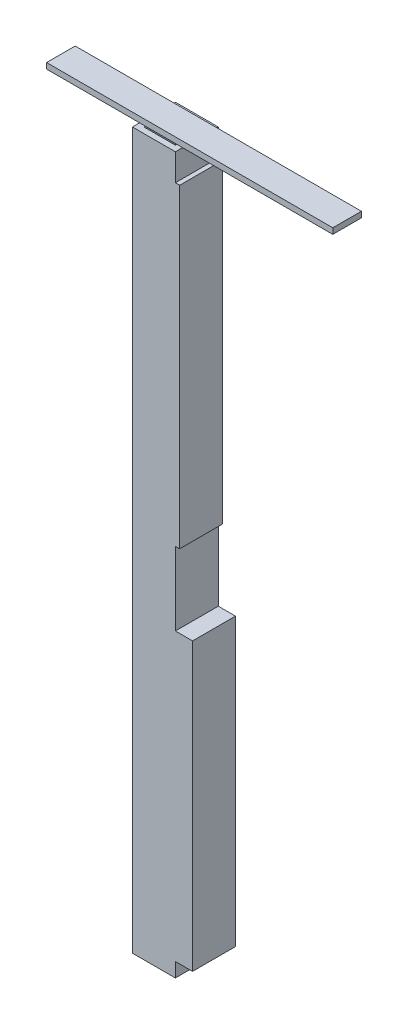
ISO-10303-21;
HEADER;
FILE_DESCRIPTION(('STEP AP214'),'2;1');
FILE_NAME('part.step','',(''),(''),'','','');
FILE_SCHEMA(('AUTOMOTIVE_DESIGN { 1 0 10303 214 1 1 1 1 }'));
ENDSEC;
DATA;
#1=APPLICATION_CONTEXT('core data for automotive mechanical design processes');
#2=APPLICATION_PROTOCOL_DEFINITION('international standard','automotive_design',2000,#1);
#3=PRODUCT_CONTEXT('',#1,'mechanical');
#4=PRODUCT('Part','Part','',(#3));
#5=PRODUCT_RELATED_PRODUCT_CATEGORY('part','',(#4));
#6=PRODUCT_DEFINITION_FORMATION('','',#4);
#7=PRODUCT_DEFINITION_CONTEXT('part definition',#1,'design');
#8=PRODUCT_DEFINITION('design','',#6,#7);
#9=PRODUCT_DEFINITION_SHAPE('','',#8);
#10=(LENGTH_UNIT() NAMED_UNIT(*) SI_UNIT(.MILLI.,.METRE.));
#11=(NAMED_UNIT(*) PLANE_ANGLE_UNIT() SI_UNIT($,.RADIAN.));
#12=(NAMED_UNIT(*) SI_UNIT($,.STERADIAN.) SOLID_ANGLE_UNIT());
#13=UNCERTAINTY_MEASURE_WITH_UNIT(LENGTH_MEASURE(1.E-05),#10,'distance_accuracy_value','');
#14=(GEOMETRIC_REPRESENTATION_CONTEXT(3) GLOBAL_UNCERTAINTY_ASSIGNED_CONTEXT((#13)) GLOBAL_UNIT_ASSIGNED_CONTEXT((#10,
#11,#12)) REPRESENTATION_CONTEXT('',''));
#15=CARTESIAN_POINT('',(0.,0.,0.));
#16=DIRECTION('',(0.,0.,1.));
#17=DIRECTION('',(1.,0.,0.));
#18=AXIS2_PLACEMENT_3D('',#15,#16,#17);
#19=CARTESIAN_POINT('',(15.,500.,-15.));
#20=DIRECTION('',(-1.,0.,0.));
#21=DIRECTION('',(0.,0.,1.));
#22=AXIS2_PLACEMENT_3D('',#19,#20,#21);
#23=PLANE('',#22);
#24=DIRECTION('',(0.,0.,-1.));
#25=VECTOR('',#24,1.);
#26=CARTESIAN_POINT('',(15.,261.238460256624,15.));
#27=LINE('',#26,#25);
#28=CARTESIAN_POINT('',(15.,261.238460256624,15.));
#29=VERTEX_POINT('',#28);
#30=CARTESIAN_POINT('',(15.,261.238460256624,-15.));
#31=VERTEX_POINT('',#30);
#32=EDGE_CURVE('E483',#29,#31,#27,.T.);
#33=ORIENTED_EDGE('',*,*,#32,.F.);
#34=DIRECTION('',(0.,-1.,0.));
#35=VECTOR('',#34,1.);
#36=CARTESIAN_POINT('',(15.,500.,15.));
#37=LINE('',#36,#35);
#38=CARTESIAN_POINT('',(15.,210.,15.));
#39=VERTEX_POINT('',#38);
#40=EDGE_CURVE('E219',#29,#39,#37,.T.);
#41=ORIENTED_EDGE('',*,*,#40,.T.);
#42=DIRECTION('',(0.,0.,1.));
#43=VECTOR('',#42,1.);
#44=CARTESIAN_POINT('',(15.,210.,15.));
#45=LINE('',#44,#43);
#46=CARTESIAN_POINT('',(15.,210.,-15.));
#47=VERTEX_POINT('',#46);
#48=EDGE_CURVE('E222',#47,#39,#45,.T.);
#49=ORIENTED_EDGE('',*,*,#48,.F.);
#50=DIRECTION('',(0.,-1.,0.));
#51=VECTOR('',#50,1.);
#52=CARTESIAN_POINT('',(15.,500.,-15.));
#53=LINE('',#52,#51);
#54=EDGE_CURVE('E350',#31,#47,#53,.T.);
#55=ORIENTED_EDGE('',*,*,#54,.F.);
#56=EDGE_LOOP('',(#33,#41,#49,#55));
#57=FACE_BOUND('',#56,.T.);
#58=ADVANCED_FACE('F33',(#57),#23,.F.);
#59=DIRECTION('',(0.,0.,1.));
#60=VECTOR('',#59,1.);
#61=CARTESIAN_POINT('',(15.,481.238460256624,15.));
#62=LINE('',#61,#60);
#63=CARTESIAN_POINT('',(15.,481.238460256624,-15.));
#64=VERTEX_POINT('',#63);
#65=CARTESIAN_POINT('',(15.,481.238460256624,15.));
#66=VERTEX_POINT('',#65);
#67=EDGE_CURVE('E213',#64,#66,#62,.T.);
#68=ORIENTED_EDGE('',*,*,#67,.F.);
#69=CARTESIAN_POINT('',(15.,500.,-15.));
#70=VERTEX_POINT('',#69);
#71=EDGE_CURVE('E347',#70,#64,#53,.T.);
#72=ORIENTED_EDGE('',*,*,#71,.F.);
#73=DIRECTION('',(0.,0.,-1.));
#74=VECTOR('',#73,1.);
#75=CARTESIAN_POINT('',(15.,500.,-15.));
#76=LINE('',#75,#74);
#77=CARTESIAN_POINT('',(15.,500.,-10.));
#78=VERTEX_POINT('',#77);
#79=EDGE_CURVE('E328',#78,#70,#76,.T.);
#80=ORIENTED_EDGE('',*,*,#79,.F.);
#81=CARTESIAN_POINT('',(15.,500.,10.));
#82=VERTEX_POINT('',#81);
#83=EDGE_CURVE('E332',#82,#78,#76,.T.);
#84=ORIENTED_EDGE('',*,*,#83,.F.);
#85=CARTESIAN_POINT('',(15.,500.,15.));
#86=VERTEX_POINT('',#85);
#87=EDGE_CURVE('E329',#86,#82,#76,.T.);
#88=ORIENTED_EDGE('',*,*,#87,.F.);
#89=EDGE_CURVE('E351',#86,#66,#37,.T.);
#90=ORIENTED_EDGE('',*,*,#89,.T.);
#91=EDGE_LOOP('',(#68,#72,#80,#84,#88,#90));
#92=FACE_BOUND('',#91,.T.);
#93=ADVANCED_FACE('F428',(#92),#23,.F.);
#94=DIRECTION('',(0.,0.,-1.));
#95=VECTOR('',#94,1.);
#96=CARTESIAN_POINT('',(15.,10.,15.));
#97=LINE('',#96,#95);
#98=CARTESIAN_POINT('',(15.,10.,15.));
#99=VERTEX_POINT('',#98);
#100=CARTESIAN_POINT('',(15.,9.99999999999995,-15.));
#101=VERTEX_POINT('',#100);
#102=EDGE_CURVE('E220',#99,#101,#97,.T.);
#103=ORIENTED_EDGE('',*,*,#102,.F.);
#104=CARTESIAN_POINT('',(15.,0.,15.));
#105=VERTEX_POINT('',#104);
#106=EDGE_CURVE('E349',#99,#105,#37,.T.);
#107=ORIENTED_EDGE('',*,*,#106,.T.);
#108=DIRECTION('',(0.,0.,-1.));
#109=VECTOR('',#108,1.);
#110=CARTESIAN_POINT('',(15.,0.,-15.));
#111=LINE('',#110,#109);
#112=CARTESIAN_POINT('',(15.,0.,-15.));
#113=VERTEX_POINT('',#112);
#114=EDGE_CURVE('E339',#105,#113,#111,.T.);
#115=ORIENTED_EDGE('',*,*,#114,.T.);
#116=EDGE_CURVE('E346',#101,#113,#53,.T.);
#117=ORIENTED_EDGE('',*,*,#116,.F.);
#118=EDGE_LOOP('',(#103,#107,#115,#117));
#119=FACE_BOUND('',#118,.T.);
#120=ADVANCED_FACE('F361',(#119),#23,.F.);
#121=CARTESIAN_POINT('',(-15.,500.,15.));
#122=DIRECTION('',(0.,1.,0.));
#123=DIRECTION('',(0.,0.,1.));
#124=AXIS2_PLACEMENT_3D('',#121,#122,#123);
#125=PLANE('',#124);
#126=DIRECTION('',(-1.,0.,0.));
#127=VECTOR('',#126,1.);
#128=CARTESIAN_POINT('',(-80.,500.,-10.));
#129=LINE('',#128,#127);
#130=CARTESIAN_POINT('',(11.,500.,-10.));
#131=VERTEX_POINT('',#130);
#132=EDGE_CURVE('E11',#78,#131,#129,.T.);
#133=ORIENTED_EDGE('',*,*,#132,.F.);
#134=ORIENTED_EDGE('',*,*,#79,.T.);
#135=DIRECTION('',(-1.,0.,0.));
#136=VECTOR('',#135,1.);
#137=CARTESIAN_POINT('',(-15.,500.,-15.));
#138=LINE('',#137,#136);
#139=CARTESIAN_POINT('',(-15.,500.,-15.));
#140=VERTEX_POINT('',#139);
#141=EDGE_CURVE('E331',#70,#140,#138,.T.);
#142=ORIENTED_EDGE('',*,*,#141,.T.);
#143=DIRECTION('',(0.,0.,1.));
#144=VECTOR('',#143,1.);
#145=CARTESIAN_POINT('',(-15.,500.,-15.));
#146=LINE('',#145,#144);
#147=CARTESIAN_POINT('',(-15.,500.,-10.));
#148=VERTEX_POINT('',#147);
#149=EDGE_CURVE('E321',#140,#148,#146,.T.);
#150=ORIENTED_EDGE('',*,*,#149,.T.);
#151=CARTESIAN_POINT('',(-11.,500.,-10.));
#152=VERTEX_POINT('',#151);
#153=EDGE_CURVE('E42',#152,#148,#129,.T.);
#154=ORIENTED_EDGE('',*,*,#153,.F.);
#155=DIRECTION('',(0.,0.,1.));
#156=VECTOR('',#155,1.);
#157=CARTESIAN_POINT('',(-11.,500.,-11.));
#158=LINE('',#157,#156);
#159=CARTESIAN_POINT('',(-11.,500.,-11.));
#160=VERTEX_POINT('',#159);
#161=EDGE_CURVE('E297',#160,#152,#158,.T.);
#162=ORIENTED_EDGE('',*,*,#161,.F.);
#163=DIRECTION('',(-1.,0.,0.));
#164=VECTOR('',#163,1.);
#165=CARTESIAN_POINT('',(-11.,500.,-11.));
#166=LINE('',#165,#164);
#167=CARTESIAN_POINT('',(11.,500.,-11.));
#168=VERTEX_POINT('',#167);
#169=EDGE_CURVE('E287',#168,#160,#166,.T.);
#170=ORIENTED_EDGE('',*,*,#169,.F.);
#171=DIRECTION('',(0.,0.,-1.));
#172=VECTOR('',#171,1.);
#173=CARTESIAN_POINT('',(11.,500.,-11.));
#174=LINE('',#173,#172);
#175=EDGE_CURVE('E304',#131,#168,#174,.T.);
#176=ORIENTED_EDGE('',*,*,#175,.F.);
#177=EDGE_LOOP('',(#133,#134,#142,#150,#154,#162,#170,#176));
#178=FACE_BOUND('',#177,.T.);
#179=ADVANCED_FACE('F380',(#178),#125,.T.);
#180=CARTESIAN_POINT('',(-15.,500.,-15.));
#181=DIRECTION('',(1.,0.,0.));
#182=DIRECTION('',(0.,0.,-1.));
#183=AXIS2_PLACEMENT_3D('',#180,#181,#182);
#184=PLANE('',#183);
#185=DIRECTION('',(0.,0.,1.));
#186=VECTOR('',#185,1.);
#187=CARTESIAN_POINT('',(-15.,0.,-15.));
#188=LINE('',#187,#186);
#189=CARTESIAN_POINT('',(-15.,0.,-15.));
#190=VERTEX_POINT('',#189);
#191=CARTESIAN_POINT('',(-15.,0.,15.));
#192=VERTEX_POINT('',#191);
#193=EDGE_CURVE('E313',#190,#192,#188,.T.);
#194=ORIENTED_EDGE('',*,*,#193,.T.);
#195=DIRECTION('',(0.,-1.,0.));
#196=VECTOR('',#195,1.);
#197=CARTESIAN_POINT('',(-15.,500.,15.));
#198=LINE('',#197,#196);
#199=CARTESIAN_POINT('',(-15.,500.,15.));
#200=VERTEX_POINT('',#199);
#201=EDGE_CURVE('E37',#200,#192,#198,.T.);
#202=ORIENTED_EDGE('',*,*,#201,.F.);
#203=CARTESIAN_POINT('',(-15.,500.,10.));
#204=VERTEX_POINT('',#203);
#205=EDGE_CURVE('E326',#204,#200,#146,.T.);
#206=ORIENTED_EDGE('',*,*,#205,.F.);
#207=EDGE_CURVE('E325',#148,#204,#146,.T.);
#208=ORIENTED_EDGE('',*,*,#207,.F.);
#209=ORIENTED_EDGE('',*,*,#149,.F.);
#210=DIRECTION('',(0.,-1.,0.));
#211=VECTOR('',#210,1.);
#212=CARTESIAN_POINT('',(-15.,500.,-15.));
#213=LINE('',#212,#211);
#214=EDGE_CURVE('E334',#140,#190,#213,.T.);
#215=ORIENTED_EDGE('',*,*,#214,.T.);
#216=EDGE_LOOP('',(#194,#202,#206,#208,#209,#215));
#217=FACE_BOUND('',#216,.T.);
#218=ADVANCED_FACE('F35',(#217),#184,.F.);
#219=CARTESIAN_POINT('',(-15.,500.,15.));
#220=DIRECTION('',(0.,0.,-1.));
#221=DIRECTION('',(-1.,0.,0.));
#222=AXIS2_PLACEMENT_3D('',#219,#220,#221);
#223=PLANE('',#222);
#224=DIRECTION('',(1.,0.,0.));
#225=VECTOR('',#224,1.);
#226=CARTESIAN_POINT('',(-15.,0.,15.));
#227=LINE('',#226,#225);
#228=EDGE_CURVE('E337',#192,#105,#227,.T.);
#229=ORIENTED_EDGE('',*,*,#228,.T.);
#230=ORIENTED_EDGE('',*,*,#106,.F.);
#231=DIRECTION('',(-1.,0.,0.));
#232=VECTOR('',#231,1.);
#233=CARTESIAN_POINT('',(27.,10.,15.));
#234=LINE('',#233,#232);
#235=CARTESIAN_POINT('',(27.,10.,15.));
#236=VERTEX_POINT('',#235);
#237=EDGE_CURVE('E245',#236,#99,#234,.T.);
#238=ORIENTED_EDGE('',*,*,#237,.F.);
#239=DIRECTION('',(0.,-1.,0.));
#240=VECTOR('',#239,1.);
#241=CARTESIAN_POINT('',(27.,210.,15.));
#242=LINE('',#241,#240);
#243=CARTESIAN_POINT('',(27.,210.,15.));
#244=VERTEX_POINT('',#243);
#245=EDGE_CURVE('E228',#244,#236,#242,.T.);
#246=ORIENTED_EDGE('',*,*,#245,.F.);
#247=DIRECTION('',(-1.,0.,0.));
#248=VECTOR('',#247,1.);
#249=CARTESIAN_POINT('',(27.,210.,15.));
#250=LINE('',#249,#248);
#251=EDGE_CURVE('E236',#244,#39,#250,.T.);
#252=ORIENTED_EDGE('',*,*,#251,.T.);
#253=ORIENTED_EDGE('',*,*,#40,.F.);
#254=DIRECTION('',(-1.,0.,0.));
#255=VECTOR('',#254,1.);
#256=CARTESIAN_POINT('',(18.,261.238460256624,15.));
#257=LINE('',#256,#255);
#258=CARTESIAN_POINT('',(18.,261.238460256624,15.));
#259=VERTEX_POINT('',#258);
#260=EDGE_CURVE('E200',#259,#29,#257,.T.);
#261=ORIENTED_EDGE('',*,*,#260,.F.);
#262=DIRECTION('',(0.,-1.,0.));
#263=VECTOR('',#262,1.);
#264=CARTESIAN_POINT('',(18.,481.238460256624,15.));
#265=LINE('',#264,#263);
#266=CARTESIAN_POINT('',(18.,481.238460256624,15.));
#267=VERTEX_POINT('',#266);
#268=EDGE_CURVE('E204',#267,#259,#265,.T.);
#269=ORIENTED_EDGE('',*,*,#268,.F.);
#270=DIRECTION('',(-1.,0.,0.));
#271=VECTOR('',#270,1.);
#272=CARTESIAN_POINT('',(18.,481.238460256624,15.));
#273=LINE('',#272,#271);
#274=EDGE_CURVE('E477',#267,#66,#273,.T.);
#275=ORIENTED_EDGE('',*,*,#274,.T.);
#276=ORIENTED_EDGE('',*,*,#89,.F.);
#277=DIRECTION('',(1.,0.,0.));
#278=VECTOR('',#277,1.);
#279=CARTESIAN_POINT('',(-15.,500.,15.));
#280=LINE('',#279,#278);
#281=EDGE_CURVE('E324',#200,#86,#280,.T.);
#282=ORIENTED_EDGE('',*,*,#281,.F.);
#283=ORIENTED_EDGE('',*,*,#201,.T.);
#284=EDGE_LOOP('',(#229,#230,#238,#246,#252,#253,#261,#269,#275,#276,#282,#283));
#285=FACE_BOUND('',#284,.T.);
#286=ADVANCED_FACE('F217',(#285),#223,.F.);
#287=CARTESIAN_POINT('',(-15.,500.,-15.));
#288=DIRECTION('',(0.,0.,1.));
#289=DIRECTION('',(1.,0.,0.));
#290=AXIS2_PLACEMENT_3D('',#287,#288,#289);
#291=PLANE('',#290);
#292=DIRECTION('',(-1.,0.,0.));
#293=VECTOR('',#292,1.);
#294=CARTESIAN_POINT('',(-15.,0.,-15.));
#295=LINE('',#294,#293);
#296=EDGE_CURVE('E342',#113,#190,#295,.T.);
#297=ORIENTED_EDGE('',*,*,#296,.T.);
#298=ORIENTED_EDGE('',*,*,#214,.F.);
#299=ORIENTED_EDGE('',*,*,#141,.F.);
#300=ORIENTED_EDGE('',*,*,#71,.T.);
#301=DIRECTION('',(-1.,0.,0.));
#302=VECTOR('',#301,1.);
#303=CARTESIAN_POINT('',(18.,481.238460256624,-15.));
#304=LINE('',#303,#302);
#305=CARTESIAN_POINT('',(18.,481.238460256624,-15.));
#306=VERTEX_POINT('',#305);
#307=EDGE_CURVE('E224',#306,#64,#304,.T.);
#308=ORIENTED_EDGE('',*,*,#307,.F.);
#309=DIRECTION('',(0.,1.,0.));
#310=VECTOR('',#309,1.);
#311=CARTESIAN_POINT('',(18.,481.238460256624,-15.));
#312=LINE('',#311,#310);
#313=CARTESIAN_POINT('',(18.,261.238460256624,-15.));
#314=VERTEX_POINT('',#313);
#315=EDGE_CURVE('E203',#314,#306,#312,.T.);
#316=ORIENTED_EDGE('',*,*,#315,.F.);
#317=DIRECTION('',(-1.,0.,0.));
#318=VECTOR('',#317,1.);
#319=CARTESIAN_POINT('',(18.,261.238460256624,-15.));
#320=LINE('',#319,#318);
#321=EDGE_CURVE('E51',#314,#31,#320,.T.);
#322=ORIENTED_EDGE('',*,*,#321,.T.);
#323=ORIENTED_EDGE('',*,*,#54,.T.);
#324=DIRECTION('',(-1.,0.,0.));
#325=VECTOR('',#324,1.);
#326=CARTESIAN_POINT('',(27.,210.,-15.));
#327=LINE('',#326,#325);
#328=CARTESIAN_POINT('',(27.,210.,-15.));
#329=VERTEX_POINT('',#328);
#330=EDGE_CURVE('E241',#329,#47,#327,.T.);
#331=ORIENTED_EDGE('',*,*,#330,.F.);
#332=DIRECTION('',(0.,1.,0.));
#333=VECTOR('',#332,1.);
#334=CARTESIAN_POINT('',(27.,210.,-15.));
#335=LINE('',#334,#333);
#336=CARTESIAN_POINT('',(27.,10.,-15.));
#337=VERTEX_POINT('',#336);
#338=EDGE_CURVE('E233',#337,#329,#335,.T.);
#339=ORIENTED_EDGE('',*,*,#338,.F.);
#340=DIRECTION('',(-1.,0.,0.));
#341=VECTOR('',#340,1.);
#342=CARTESIAN_POINT('',(27.,10.,-15.));
#343=LINE('',#342,#341);
#344=EDGE_CURVE('E58',#337,#101,#343,.T.);
#345=ORIENTED_EDGE('',*,*,#344,.T.);
#346=ORIENTED_EDGE('',*,*,#116,.T.);
#347=EDGE_LOOP('',(#297,#298,#299,#300,#308,#316,#322,#323,#331,#339,#345,#346));
#348=FACE_BOUND('',#347,.T.);
#349=ADVANCED_FACE('F372',(#348),#291,.F.);
#350=DIRECTION('',(1.,0.,0.));
#351=VECTOR('',#350,1.);
#352=CARTESIAN_POINT('',(-80.,500.,10.));
#353=LINE('',#352,#351);
#354=CARTESIAN_POINT('',(-11.,500.,10.));
#355=VERTEX_POINT('',#354);
#356=EDGE_CURVE('E391',#204,#355,#353,.T.);
#357=ORIENTED_EDGE('',*,*,#356,.F.);
#358=ORIENTED_EDGE('',*,*,#205,.T.);
#359=ORIENTED_EDGE('',*,*,#281,.T.);
#360=ORIENTED_EDGE('',*,*,#87,.T.);
#361=CARTESIAN_POINT('',(11.,500.,10.));
#362=VERTEX_POINT('',#361);
#363=EDGE_CURVE('E267',#362,#82,#353,.T.);
#364=ORIENTED_EDGE('',*,*,#363,.F.);
#365=CARTESIAN_POINT('',(11.,500.,11.));
#366=VERTEX_POINT('',#365);
#367=EDGE_CURVE('E305',#366,#362,#174,.T.);
#368=ORIENTED_EDGE('',*,*,#367,.F.);
#369=DIRECTION('',(1.,0.,0.));
#370=VECTOR('',#369,1.);
#371=CARTESIAN_POINT('',(-11.,500.,11.));
#372=LINE('',#371,#370);
#373=CARTESIAN_POINT('',(-11.,500.,11.));
#374=VERTEX_POINT('',#373);
#375=EDGE_CURVE('E300',#374,#366,#372,.T.);
#376=ORIENTED_EDGE('',*,*,#375,.F.);
#377=EDGE_CURVE('E282',#355,#374,#158,.T.);
#378=ORIENTED_EDGE('',*,*,#377,.F.);
#379=EDGE_LOOP('',(#357,#358,#359,#360,#364,#368,#376,#378));
#380=FACE_BOUND('',#379,.T.);
#381=ADVANCED_FACE('F440',(#380),#125,.T.);
#382=CARTESIAN_POINT('',(-15.,0.,15.));
#383=DIRECTION('',(0.,1.,0.));
#384=DIRECTION('',(0.,0.,1.));
#385=AXIS2_PLACEMENT_3D('',#382,#383,#384);
#386=PLANE('',#385);
#387=DIRECTION('',(-1.,0.,0.));
#388=VECTOR('',#387,1.);
#389=CARTESIAN_POINT('',(-11.,0.,-11.));
#390=LINE('',#389,#388);
#391=CARTESIAN_POINT('',(11.,0.,-11.));
#392=VERTEX_POINT('',#391);
#393=CARTESIAN_POINT('',(-11.,0.,-11.));
#394=VERTEX_POINT('',#393);
#395=EDGE_CURVE('E293',#392,#394,#390,.T.);
#396=ORIENTED_EDGE('',*,*,#395,.T.);
#397=DIRECTION('',(0.,0.,1.));
#398=VECTOR('',#397,1.);
#399=CARTESIAN_POINT('',(-11.,0.,-11.));
#400=LINE('',#399,#398);
#401=CARTESIAN_POINT('',(-11.,0.,11.));
#402=VERTEX_POINT('',#401);
#403=EDGE_CURVE('E283',#394,#402,#400,.T.);
#404=ORIENTED_EDGE('',*,*,#403,.T.);
#405=DIRECTION('',(1.,0.,0.));
#406=VECTOR('',#405,1.);
#407=CARTESIAN_POINT('',(-11.,0.,11.));
#408=LINE('',#407,#406);
#409=CARTESIAN_POINT('',(11.,0.,11.));
#410=VERTEX_POINT('',#409);
#411=EDGE_CURVE('E286',#402,#410,#408,.T.);
#412=ORIENTED_EDGE('',*,*,#411,.T.);
#413=DIRECTION('',(0.,0.,-1.));
#414=VECTOR('',#413,1.);
#415=CARTESIAN_POINT('',(11.,0.,-11.));
#416=LINE('',#415,#414);
#417=EDGE_CURVE('E290',#410,#392,#416,.T.);
#418=ORIENTED_EDGE('',*,*,#417,.T.);
#419=EDGE_LOOP('',(#396,#404,#412,#418));
#420=FACE_BOUND('',#419,.T.);
#421=ORIENTED_EDGE('',*,*,#193,.F.);
#422=ORIENTED_EDGE('',*,*,#296,.F.);
#423=ORIENTED_EDGE('',*,*,#114,.F.);
#424=ORIENTED_EDGE('',*,*,#228,.F.);
#425=EDGE_LOOP('',(#421,#422,#423,#424));
#426=FACE_BOUND('',#425,.T.);
#427=ADVANCED_FACE('F370',(#420,#426),#386,.F.);
#428=CARTESIAN_POINT('',(-11.,0.,-11.));
#429=DIRECTION('',(-1.,0.,0.));
#430=DIRECTION('',(0.,0.,1.));
#431=AXIS2_PLACEMENT_3D('',#428,#429,#430);
#432=PLANE('',#431);
#433=ORIENTED_EDGE('',*,*,#161,.T.);
#434=EDGE_CURVE('E301',#152,#355,#158,.T.);
#435=ORIENTED_EDGE('',*,*,#434,.T.);
#436=ORIENTED_EDGE('',*,*,#377,.T.);
#437=DIRECTION('',(0.,1.,0.));
#438=VECTOR('',#437,1.);
#439=CARTESIAN_POINT('',(-11.,0.,11.));
#440=LINE('',#439,#438);
#441=EDGE_CURVE('E296',#402,#374,#440,.T.);
#442=ORIENTED_EDGE('',*,*,#441,.F.);
#443=ORIENTED_EDGE('',*,*,#403,.F.);
#444=DIRECTION('',(0.,1.,0.));
#445=VECTOR('',#444,1.);
#446=CARTESIAN_POINT('',(-11.,0.,-11.));
#447=LINE('',#446,#445);
#448=EDGE_CURVE('E311',#394,#160,#447,.T.);
#449=ORIENTED_EDGE('',*,*,#448,.T.);
#450=EDGE_LOOP('',(#433,#435,#436,#442,#443,#449));
#451=FACE_BOUND('',#450,.T.);
#452=ADVANCED_FACE('F452',(#451),#432,.F.);
#453=CARTESIAN_POINT('',(-11.,0.,-11.));
#454=DIRECTION('',(0.,0.,-1.));
#455=DIRECTION('',(-1.,0.,0.));
#456=AXIS2_PLACEMENT_3D('',#453,#454,#455);
#457=PLANE('',#456);
#458=ORIENTED_EDGE('',*,*,#169,.T.);
#459=ORIENTED_EDGE('',*,*,#448,.F.);
#460=ORIENTED_EDGE('',*,*,#395,.F.);
#461=DIRECTION('',(0.,1.,0.));
#462=VECTOR('',#461,1.);
#463=CARTESIAN_POINT('',(11.,0.,-11.));
#464=LINE('',#463,#462);
#465=EDGE_CURVE('E314',#392,#168,#464,.T.);
#466=ORIENTED_EDGE('',*,*,#465,.T.);
#467=EDGE_LOOP('',(#458,#459,#460,#466));
#468=FACE_BOUND('',#467,.T.);
#469=ADVANCED_FACE('F467',(#468),#457,.F.);
#470=CARTESIAN_POINT('',(11.,0.,-11.));
#471=DIRECTION('',(1.,0.,0.));
#472=DIRECTION('',(0.,0.,-1.));
#473=AXIS2_PLACEMENT_3D('',#470,#471,#472);
#474=PLANE('',#473);
#475=ORIENTED_EDGE('',*,*,#367,.T.);
#476=EDGE_CURVE('E308',#362,#131,#174,.T.);
#477=ORIENTED_EDGE('',*,*,#476,.T.);
#478=ORIENTED_EDGE('',*,*,#175,.T.);
#479=ORIENTED_EDGE('',*,*,#465,.F.);
#480=ORIENTED_EDGE('',*,*,#417,.F.);
#481=DIRECTION('',(0.,1.,0.));
#482=VECTOR('',#481,1.);
#483=CARTESIAN_POINT('',(11.,0.,11.));
#484=LINE('',#483,#482);
#485=EDGE_CURVE('E317',#410,#366,#484,.T.);
#486=ORIENTED_EDGE('',*,*,#485,.T.);
#487=EDGE_LOOP('',(#475,#477,#478,#479,#480,#486));
#488=FACE_BOUND('',#487,.T.);
#489=ADVANCED_FACE('F463',(#488),#474,.F.);
#490=CARTESIAN_POINT('',(-11.,0.,11.));
#491=DIRECTION('',(0.,0.,1.));
#492=DIRECTION('',(1.,0.,0.));
#493=AXIS2_PLACEMENT_3D('',#490,#491,#492);
#494=PLANE('',#493);
#495=ORIENTED_EDGE('',*,*,#375,.T.);
#496=ORIENTED_EDGE('',*,*,#485,.F.);
#497=ORIENTED_EDGE('',*,*,#411,.F.);
#498=ORIENTED_EDGE('',*,*,#441,.T.);
#499=EDGE_LOOP('',(#495,#496,#497,#498));
#500=FACE_BOUND('',#499,.T.);
#501=ADVANCED_FACE('F472',(#500),#494,.F.);
#502=CARTESIAN_POINT('',(-80.,500.,10.));
#503=DIRECTION('',(0.,1.,0.));
#504=DIRECTION('',(0.,0.,1.));
#505=AXIS2_PLACEMENT_3D('',#502,#503,#504);
#506=PLANE('',#505);
#507=CARTESIAN_POINT('',(-80.,500.,-10.));
#508=VERTEX_POINT('',#507);
#509=EDGE_CURVE('E268',#148,#508,#129,.T.);
#510=ORIENTED_EDGE('',*,*,#509,.F.);
#511=ORIENTED_EDGE('',*,*,#207,.T.);
#512=CARTESIAN_POINT('',(-80.,500.,10.));
#513=VERTEX_POINT('',#512);
#514=EDGE_CURVE('E262',#513,#204,#353,.T.);
#515=ORIENTED_EDGE('',*,*,#514,.F.);
#516=DIRECTION('',(0.,0.,1.));
#517=VECTOR('',#516,1.);
#518=CARTESIAN_POINT('',(-80.,500.,-10.));
#519=LINE('',#518,#517);
#520=EDGE_CURVE('E247',#508,#513,#519,.T.);
#521=ORIENTED_EDGE('',*,*,#520,.F.);
#522=EDGE_LOOP('',(#510,#511,#515,#521));
#523=FACE_BOUND('',#522,.T.);
#524=ADVANCED_FACE('F385',(#523),#506,.F.);
#525=CARTESIAN_POINT('',(120.,500.,10.));
#526=VERTEX_POINT('',#525);
#527=EDGE_CURVE('E261',#82,#526,#353,.T.);
#528=ORIENTED_EDGE('',*,*,#527,.F.);
#529=ORIENTED_EDGE('',*,*,#83,.T.);
#530=CARTESIAN_POINT('',(120.,500.,-10.));
#531=VERTEX_POINT('',#530);
#532=EDGE_CURVE('E252',#531,#78,#129,.T.);
#533=ORIENTED_EDGE('',*,*,#532,.F.);
#534=DIRECTION('',(0.,0.,-1.));
#535=VECTOR('',#534,1.);
#536=CARTESIAN_POINT('',(120.,500.,-10.));
#537=LINE('',#536,#535);
#538=EDGE_CURVE('E265',#526,#531,#537,.T.);
#539=ORIENTED_EDGE('',*,*,#538,.F.);
#540=EDGE_LOOP('',(#528,#529,#533,#539));
#541=FACE_BOUND('',#540,.T.);
#542=ADVANCED_FACE('F408',(#541),#506,.F.);
#543=CARTESIAN_POINT('',(-80.,504.,-10.));
#544=DIRECTION('',(1.,0.,0.));
#545=DIRECTION('',(0.,0.,-1.));
#546=AXIS2_PLACEMENT_3D('',#543,#544,#545);
#547=PLANE('',#546);
#548=ORIENTED_EDGE('',*,*,#520,.T.);
#549=DIRECTION('',(0.,-1.,0.));
#550=VECTOR('',#549,1.);
#551=CARTESIAN_POINT('',(-80.,504.,10.));
#552=LINE('',#551,#550);
#553=CARTESIAN_POINT('',(-80.,504.,10.));
#554=VERTEX_POINT('',#553);
#555=EDGE_CURVE('E279',#554,#513,#552,.T.);
#556=ORIENTED_EDGE('',*,*,#555,.F.);
#557=DIRECTION('',(0.,0.,1.));
#558=VECTOR('',#557,1.);
#559=CARTESIAN_POINT('',(-80.,504.,-10.));
#560=LINE('',#559,#558);
#561=CARTESIAN_POINT('',(-80.,504.,-10.));
#562=VERTEX_POINT('',#561);
#563=EDGE_CURVE('E248',#562,#554,#560,.T.);
#564=ORIENTED_EDGE('',*,*,#563,.F.);
#565=DIRECTION('',(0.,-1.,0.));
#566=VECTOR('',#565,1.);
#567=CARTESIAN_POINT('',(-80.,504.,-10.));
#568=LINE('',#567,#566);
#569=EDGE_CURVE('E258',#562,#508,#568,.T.);
#570=ORIENTED_EDGE('',*,*,#569,.T.);
#571=EDGE_LOOP('',(#548,#556,#564,#570));
#572=FACE_BOUND('',#571,.T.);
#573=ADVANCED_FACE('F416',(#572),#547,.F.);
#574=CARTESIAN_POINT('',(-80.,504.,10.));
#575=DIRECTION('',(0.,0.,-1.));
#576=DIRECTION('',(-1.,0.,0.));
#577=AXIS2_PLACEMENT_3D('',#574,#575,#576);
#578=PLANE('',#577);
#579=ORIENTED_EDGE('',*,*,#514,.T.);
#580=ORIENTED_EDGE('',*,*,#356,.T.);
#581=EDGE_CURVE('E266',#355,#362,#353,.T.);
#582=ORIENTED_EDGE('',*,*,#581,.T.);
#583=ORIENTED_EDGE('',*,*,#363,.T.);
#584=ORIENTED_EDGE('',*,*,#527,.T.);
#585=DIRECTION('',(0.,-1.,0.));
#586=VECTOR('',#585,1.);
#587=CARTESIAN_POINT('',(120.,504.,10.));
#588=LINE('',#587,#586);
#589=CARTESIAN_POINT('',(120.,504.,10.));
#590=VERTEX_POINT('',#589);
#591=EDGE_CURVE('E276',#590,#526,#588,.T.);
#592=ORIENTED_EDGE('',*,*,#591,.F.);
#593=DIRECTION('',(1.,0.,0.));
#594=VECTOR('',#593,1.);
#595=CARTESIAN_POINT('',(-80.,504.,10.));
#596=LINE('',#595,#594);
#597=EDGE_CURVE('E251',#554,#590,#596,.T.);
#598=ORIENTED_EDGE('',*,*,#597,.F.);
#599=ORIENTED_EDGE('',*,*,#555,.T.);
#600=EDGE_LOOP('',(#579,#580,#582,#583,#584,#592,#598,#599));
#601=FACE_BOUND('',#600,.T.);
#602=ADVANCED_FACE('F399',(#601),#578,.F.);
#603=CARTESIAN_POINT('',(120.,504.,-10.));
#604=DIRECTION('',(-1.,0.,0.));
#605=DIRECTION('',(0.,0.,1.));
#606=AXIS2_PLACEMENT_3D('',#603,#604,#605);
#607=PLANE('',#606);
#608=ORIENTED_EDGE('',*,*,#538,.T.);
#609=DIRECTION('',(0.,-1.,0.));
#610=VECTOR('',#609,1.);
#611=CARTESIAN_POINT('',(120.,504.,-10.));
#612=LINE('',#611,#610);
#613=CARTESIAN_POINT('',(120.,504.,-10.));
#614=VERTEX_POINT('',#613);
#615=EDGE_CURVE('E273',#614,#531,#612,.T.);
#616=ORIENTED_EDGE('',*,*,#615,.F.);
#617=DIRECTION('',(0.,0.,-1.));
#618=VECTOR('',#617,1.);
#619=CARTESIAN_POINT('',(120.,504.,-10.));
#620=LINE('',#619,#618);
#621=EDGE_CURVE('E254',#590,#614,#620,.T.);
#622=ORIENTED_EDGE('',*,*,#621,.F.);
#623=ORIENTED_EDGE('',*,*,#591,.T.);
#624=EDGE_LOOP('',(#608,#616,#622,#623));
#625=FACE_BOUND('',#624,.T.);
#626=ADVANCED_FACE('F405',(#625),#607,.F.);
#627=CARTESIAN_POINT('',(-80.,504.,-10.));
#628=DIRECTION('',(0.,0.,1.));
#629=DIRECTION('',(1.,0.,0.));
#630=AXIS2_PLACEMENT_3D('',#627,#628,#629);
#631=PLANE('',#630);
#632=ORIENTED_EDGE('',*,*,#532,.T.);
#633=ORIENTED_EDGE('',*,*,#132,.T.);
#634=EDGE_CURVE('E44',#131,#152,#129,.T.);
#635=ORIENTED_EDGE('',*,*,#634,.T.);
#636=ORIENTED_EDGE('',*,*,#153,.T.);
#637=ORIENTED_EDGE('',*,*,#509,.T.);
#638=ORIENTED_EDGE('',*,*,#569,.F.);
#639=DIRECTION('',(-1.,0.,0.));
#640=VECTOR('',#639,1.);
#641=CARTESIAN_POINT('',(-80.,504.,-10.));
#642=LINE('',#641,#640);
#643=EDGE_CURVE('E256',#614,#562,#642,.T.);
#644=ORIENTED_EDGE('',*,*,#643,.F.);
#645=ORIENTED_EDGE('',*,*,#615,.T.);
#646=EDGE_LOOP('',(#632,#633,#635,#636,#637,#638,#644,#645));
#647=FACE_BOUND('',#646,.T.);
#648=ADVANCED_FACE('F389',(#647),#631,.F.);
#649=CARTESIAN_POINT('',(-80.,504.,10.));
#650=DIRECTION('',(0.,1.,0.));
#651=DIRECTION('',(0.,0.,1.));
#652=AXIS2_PLACEMENT_3D('',#649,#650,#651);
#653=PLANE('',#652);
#654=ORIENTED_EDGE('',*,*,#563,.T.);
#655=ORIENTED_EDGE('',*,*,#597,.T.);
#656=ORIENTED_EDGE('',*,*,#621,.T.);
#657=ORIENTED_EDGE('',*,*,#643,.T.);
#658=EDGE_LOOP('',(#654,#655,#656,#657));
#659=FACE_BOUND('',#658,.T.);
#660=ADVANCED_FACE('F413',(#659),#653,.T.);
#661=ORIENTED_EDGE('',*,*,#434,.F.);
#662=ORIENTED_EDGE('',*,*,#634,.F.);
#663=ORIENTED_EDGE('',*,*,#476,.F.);
#664=ORIENTED_EDGE('',*,*,#581,.F.);
#665=EDGE_LOOP('',(#661,#662,#663,#664));
#666=FACE_BOUND('',#665,.T.);
#667=ADVANCED_FACE('F425',(#666),#506,.F.);
#668=CARTESIAN_POINT('',(27.,10.,15.));
#669=DIRECTION('',(0.,1.,0.));
#670=DIRECTION('',(0.,0.,1.));
#671=AXIS2_PLACEMENT_3D('',#668,#669,#670);
#672=PLANE('',#671);
#673=ORIENTED_EDGE('',*,*,#102,.T.);
#674=ORIENTED_EDGE('',*,*,#344,.F.);
#675=DIRECTION('',(0.,0.,-1.));
#676=VECTOR('',#675,1.);
#677=CARTESIAN_POINT('',(27.,10.,15.));
#678=LINE('',#677,#676);
#679=EDGE_CURVE('E231',#236,#337,#678,.T.);
#680=ORIENTED_EDGE('',*,*,#679,.F.);
#681=ORIENTED_EDGE('',*,*,#237,.T.);
#682=EDGE_LOOP('',(#673,#674,#680,#681));
#683=FACE_BOUND('',#682,.T.);
#684=ADVANCED_FACE('F496',(#683),#672,.F.);
#685=CARTESIAN_POINT('',(27.,210.,15.));
#686=DIRECTION('',(0.,-1.,0.));
#687=DIRECTION('',(0.,0.,-1.));
#688=AXIS2_PLACEMENT_3D('',#685,#686,#687);
#689=PLANE('',#688);
#690=ORIENTED_EDGE('',*,*,#48,.T.);
#691=ORIENTED_EDGE('',*,*,#251,.F.);
#692=DIRECTION('',(0.,0.,1.));
#693=VECTOR('',#692,1.);
#694=CARTESIAN_POINT('',(27.,210.,15.));
#695=LINE('',#694,#693);
#696=EDGE_CURVE('E235',#329,#244,#695,.T.);
#697=ORIENTED_EDGE('',*,*,#696,.F.);
#698=ORIENTED_EDGE('',*,*,#330,.T.);
#699=EDGE_LOOP('',(#690,#691,#697,#698));
#700=FACE_BOUND('',#699,.T.);
#701=ADVANCED_FACE('F490',(#700),#689,.F.);
#702=CARTESIAN_POINT('',(27.,210.,15.));
#703=DIRECTION('',(1.,0.,0.));
#704=DIRECTION('',(0.,0.,-1.));
#705=AXIS2_PLACEMENT_3D('',#702,#703,#704);
#706=PLANE('',#705);
#707=ORIENTED_EDGE('',*,*,#245,.T.);
#708=ORIENTED_EDGE('',*,*,#679,.T.);
#709=ORIENTED_EDGE('',*,*,#338,.T.);
#710=ORIENTED_EDGE('',*,*,#696,.T.);
#711=EDGE_LOOP('',(#707,#708,#709,#710));
#712=FACE_BOUND('',#711,.T.);
#713=ADVANCED_FACE('F494',(#712),#706,.T.);
#714=CARTESIAN_POINT('',(18.,261.238460256624,15.));
#715=DIRECTION('',(0.,1.,0.));
#716=DIRECTION('',(0.,0.,1.));
#717=AXIS2_PLACEMENT_3D('',#714,#715,#716);
#718=PLANE('',#717);
#719=ORIENTED_EDGE('',*,*,#32,.T.);
#720=ORIENTED_EDGE('',*,*,#321,.F.);
#721=DIRECTION('',(0.,0.,-1.));
#722=VECTOR('',#721,1.);
#723=CARTESIAN_POINT('',(18.,261.238460256624,15.));
#724=LINE('',#723,#722);
#725=EDGE_CURVE('E196',#259,#314,#724,.T.);
#726=ORIENTED_EDGE('',*,*,#725,.F.);
#727=ORIENTED_EDGE('',*,*,#260,.T.);
#728=EDGE_LOOP('',(#719,#720,#726,#727));
#729=FACE_BOUND('',#728,.T.);
#730=ADVANCED_FACE('F198',(#729),#718,.F.);
#731=CARTESIAN_POINT('',(18.,481.238460256624,15.));
#732=DIRECTION('',(0.,-1.,0.));
#733=DIRECTION('',(0.,0.,-1.));
#734=AXIS2_PLACEMENT_3D('',#731,#732,#733);
#735=PLANE('',#734);
#736=ORIENTED_EDGE('',*,*,#67,.T.);
#737=ORIENTED_EDGE('',*,*,#274,.F.);
#738=DIRECTION('',(0.,0.,1.));
#739=VECTOR('',#738,1.);
#740=CARTESIAN_POINT('',(18.,481.238460256624,15.));
#741=LINE('',#740,#739);
#742=EDGE_CURVE('E209',#306,#267,#741,.T.);
#743=ORIENTED_EDGE('',*,*,#742,.F.);
#744=ORIENTED_EDGE('',*,*,#307,.T.);
#745=EDGE_LOOP('',(#736,#737,#743,#744));
#746=FACE_BOUND('',#745,.T.);
#747=ADVANCED_FACE('F478',(#746),#735,.F.);
#748=CARTESIAN_POINT('',(18.,261.238460256624,15.));
#749=DIRECTION('',(1.,0.,0.));
#750=DIRECTION('',(0.,0.,-1.));
#751=AXIS2_PLACEMENT_3D('',#748,#749,#750);
#752=PLANE('',#751);
#753=ORIENTED_EDGE('',*,*,#268,.T.);
#754=ORIENTED_EDGE('',*,*,#725,.T.);
#755=ORIENTED_EDGE('',*,*,#315,.T.);
#756=ORIENTED_EDGE('',*,*,#742,.T.);
#757=EDGE_LOOP('',(#753,#754,#755,#756));
#758=FACE_BOUND('',#757,.T.);
#759=ADVANCED_FACE('F207',(#758),#752,.T.);
#760=CLOSED_SHELL('',(#58,#93,#120,#179,#218,#286,#349,#381,#427,#452,#469,#489,#501,#524,#542,
#573,#602,#626,#648,#660,#667,#684,#701,#713,#730,#747,#759));
#761=MANIFOLD_SOLID_BREP('B2',#760);
#762=ADVANCED_BREP_SHAPE_REPRESENTATION('',(#18,#761),#14);
#763=SHAPE_DEFINITION_REPRESENTATION(#9,#762);
ENDSEC;
END-ISO-10303-21;
